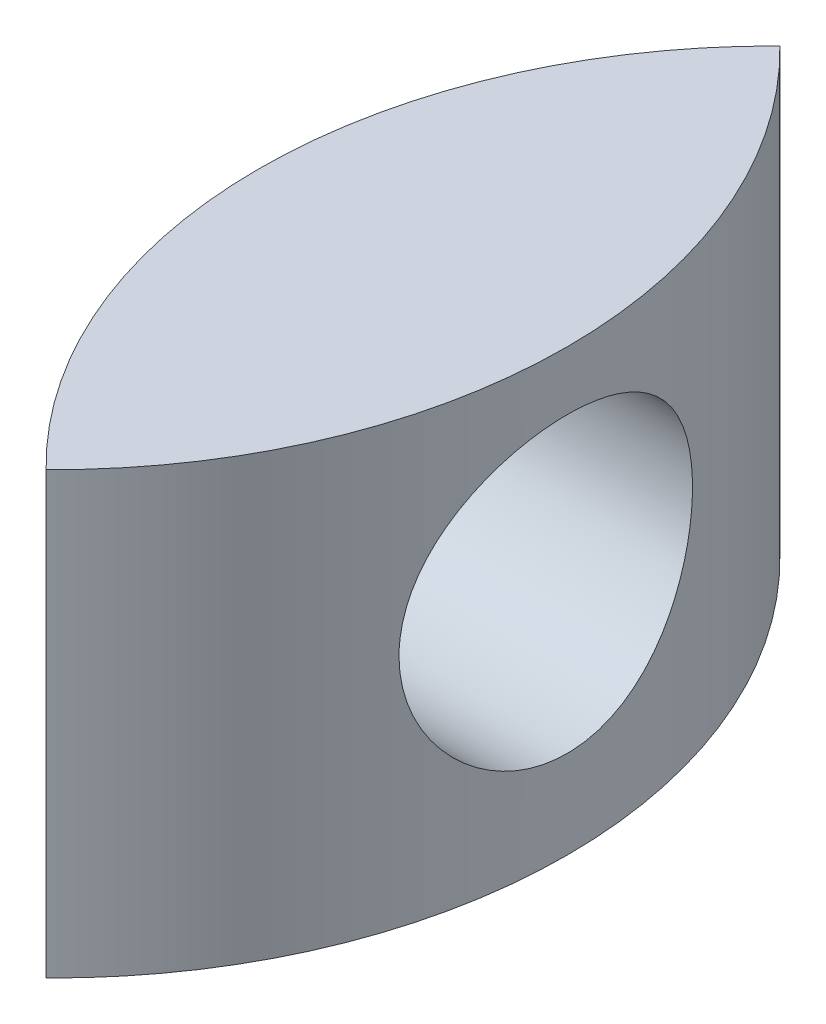
ISO-10303-21;
HEADER;
FILE_DESCRIPTION(('STEP AP214'),'2;1');
FILE_NAME('part.step','',(''),(''),'','','');
FILE_SCHEMA(('AUTOMOTIVE_DESIGN { 1 0 10303 214 1 1 1 1 }'));
ENDSEC;
DATA;
#1=APPLICATION_CONTEXT('core data for automotive mechanical design processes');
#2=APPLICATION_PROTOCOL_DEFINITION('international standard','automotive_design',2000,#1);
#3=PRODUCT_CONTEXT('',#1,'mechanical');
#4=PRODUCT('Part','Part','',(#3));
#5=PRODUCT_RELATED_PRODUCT_CATEGORY('part','',(#4));
#6=PRODUCT_DEFINITION_FORMATION('','',#4);
#7=PRODUCT_DEFINITION_CONTEXT('part definition',#1,'design');
#8=PRODUCT_DEFINITION('design','',#6,#7);
#9=PRODUCT_DEFINITION_SHAPE('','',#8);
#10=(LENGTH_UNIT() NAMED_UNIT(*) SI_UNIT(.MILLI.,.METRE.));
#11=(NAMED_UNIT(*) PLANE_ANGLE_UNIT() SI_UNIT($,.RADIAN.));
#12=(NAMED_UNIT(*) SI_UNIT($,.STERADIAN.) SOLID_ANGLE_UNIT());
#13=UNCERTAINTY_MEASURE_WITH_UNIT(LENGTH_MEASURE(1.E-05),#10,'distance_accuracy_value','');
#14=(GEOMETRIC_REPRESENTATION_CONTEXT(3) GLOBAL_UNCERTAINTY_ASSIGNED_CONTEXT((#13)) GLOBAL_UNIT_ASSIGNED_CONTEXT((#10,
#11,#12)) REPRESENTATION_CONTEXT('',''));
#15=CARTESIAN_POINT('',(0.,0.,0.));
#16=DIRECTION('',(0.,0.,1.));
#17=DIRECTION('',(1.,0.,0.));
#18=AXIS2_PLACEMENT_3D('',#15,#16,#17);
#19=CARTESIAN_POINT('',(-62.2170394666927,76.2,0.));
#20=DIRECTION('',(0.,-1.,0.));
#21=DIRECTION('',(0.,0.,-1.));
#22=AXIS2_PLACEMENT_3D('',#19,#20,#21);
#23=CYLINDRICAL_SURFACE('',#22,88.9);
#24=CARTESIAN_POINT('',(22.9771504760493,40.64,25.4));
#25=CARTESIAN_POINT('',(22.9771518354404,39.9424057015569,25.3999980746329));
#26=CARTESIAN_POINT('',(22.9857419587765,39.244776471506,25.3712372082804));
#27=CARTESIAN_POINT('',(23.0198378917772,37.8546390767836,25.2564500157261));
#28=CARTESIAN_POINT('',(23.0453448415515,37.162131260451,25.1704198298564));
#29=CARTESIAN_POINT('',(23.1124941217313,35.7870553496211,24.941829653869));
#30=CARTESIAN_POINT('',(23.1541421950163,35.1044908826712,24.7992495433295));
#31=CARTESIAN_POINT('',(23.252300278365,33.7544079375064,24.4588081272709));
#32=CARTESIAN_POINT('',(23.3088101108994,33.0868892796671,24.2609474820971));
#33=CARTESIAN_POINT('',(23.4349035426881,31.7724933208569,23.8119484715432));
#34=CARTESIAN_POINT('',(23.504466371654,31.125585111163,23.5608946677203));
#35=CARTESIAN_POINT('',(23.6547063885966,29.8555472656057,23.0072916101955));
#36=CARTESIAN_POINT('',(23.7353835991451,29.2324176780372,22.7047422519122));
#37=CARTESIAN_POINT('',(23.9055842944307,28.013819816182,22.0503497469156));
#38=CARTESIAN_POINT('',(23.9951084566809,27.4183536655455,21.6985028240554));
#39=CARTESIAN_POINT('',(24.1805428459612,26.2587665543504,20.9479627721249));
#40=CARTESIAN_POINT('',(24.2764531992645,25.6946462139922,20.5492687166349));
#41=CARTESIAN_POINT('',(24.47463579049,24.5869250120734,19.696696724419));
#42=CARTESIAN_POINT('',(24.5770085826111,24.0442382993994,19.2416540098721));
#43=CARTESIAN_POINT('',(24.7829457648739,22.9988517344297,18.2879875547486));
#44=CARTESIAN_POINT('',(24.8865101738679,22.4961525157615,17.7893631238545));
#45=CARTESIAN_POINT('',(25.0920190663341,21.5339093671124,16.7516575656736));
#46=CARTESIAN_POINT('',(25.1939633657522,21.0743703116768,16.2125718809992));
#47=CARTESIAN_POINT('',(25.393459229789,20.201554927874,15.0973946242599));
#48=CARTESIAN_POINT('',(25.4910107669529,19.7882788886267,14.5213028209613));
#49=CARTESIAN_POINT('',(25.6808326621408,19.0036048858582,13.3247050278436));
#50=CARTESIAN_POINT('',(25.7729706449731,18.633131377724,12.70357121818));
#51=CARTESIAN_POINT('',(25.9473396119169,17.9459868524624,11.4308682615547));
#52=CARTESIAN_POINT('',(26.0295704360614,17.6293167040424,10.7792986233935));
#53=CARTESIAN_POINT('',(26.1817603841931,17.0523916266243,9.45036310243901));
#54=CARTESIAN_POINT('',(26.2517213539893,16.7921282107189,8.77300111839539));
#55=CARTESIAN_POINT('',(26.3773565400985,16.3301984058481,7.39729554855956));
#56=CARTESIAN_POINT('',(26.4330311960747,16.1285302135817,6.69895260919808));
#57=CARTESIAN_POINT('',(26.5272144705206,15.7900838781734,5.30496092372372));
#58=CARTESIAN_POINT('',(26.5661331814238,15.6517495403735,4.6097175418189));
#59=CARTESIAN_POINT('',(26.6277740667931,15.4336145417296,3.2093952640432));
#60=CARTESIAN_POINT('',(26.6504964968538,15.3538129571758,2.5043165235638));
#61=CARTESIAN_POINT('',(26.6790958475958,15.2534840743216,1.08973048220658));
#62=CARTESIAN_POINT('',(26.6849755573896,15.2329469619684,0.380223934066989));
#63=CARTESIAN_POINT('',(26.6797289587866,15.2513111284601,-1.03795021217094));
#64=CARTESIAN_POINT('',(26.6686029312467,15.2902114256711,-1.74661782393123));
#65=CARTESIAN_POINT('',(26.6302294100133,15.4250997413191,-3.137300918762));
#66=CARTESIAN_POINT('',(26.6034581364429,15.519401834502,-3.81949389131813));
#67=CARTESIAN_POINT('',(26.5349015500499,15.762888643855,-5.17322775398397));
#68=CARTESIAN_POINT('',(26.4931165775056,15.9120721161671,-5.84476888515237));
#69=CARTESIAN_POINT('',(26.3956388149616,16.2640830939341,-7.17262051759684));
#70=CARTESIAN_POINT('',(26.3399455234757,16.4669125336935,-7.82893046875627));
#71=CARTESIAN_POINT('',(26.2161108044025,16.9245921903194,-9.1219403113126));
#72=CARTESIAN_POINT('',(26.1479691574853,17.1794433237749,-9.75863985695918));
#73=CARTESIAN_POINT('',(26.0001975160251,17.7422837187656,-11.015155759701));
#74=CARTESIAN_POINT('',(25.9204502975067,18.0508223679591,-11.6347121456925));
#75=CARTESIAN_POINT('',(25.7521159620121,18.7168143933,-12.8456783516543));
#76=CARTESIAN_POINT('',(25.6635288130473,19.0742679464554,-13.4370880697601));
#77=CARTESIAN_POINT('',(25.4797855914592,19.8356830670894,-14.5882388491195));
#78=CARTESIAN_POINT('',(25.3846283267694,20.2396530833318,-15.1479741297378));
#79=CARTESIAN_POINT('',(25.1902021296731,21.0913999241076,-16.232300473697));
#80=CARTESIAN_POINT('',(25.0909330988572,21.5391777974701,-16.756890695103));
#81=CARTESIAN_POINT('',(24.8873162455825,22.4921912279046,-17.785548051137));
#82=CARTESIAN_POINT('',(24.7829125026208,22.9988924966073,-18.2882471716354));
#83=CARTESIAN_POINT('',(24.5753212837435,24.0529325524353,-19.2493611635747));
#84=CARTESIAN_POINT('',(24.4721338370555,24.6002723138042,-19.7077749727389));
#85=CARTESIAN_POINT('',(24.2698647928347,25.7321293957155,-20.5772862789485));
#86=CARTESIAN_POINT('',(24.170783559104,26.316649998824,-20.9883795892059));
#87=CARTESIAN_POINT('',(23.9795769953594,27.5190654717554,-21.7603191824327));
#88=CARTESIAN_POINT('',(23.8874516351986,28.1369601969141,-22.1211656831786));
#89=CARTESIAN_POINT('',(23.7121628320087,29.4071663464714,-22.7926222204903));
#90=CARTESIAN_POINT('',(23.6290773110291,30.0597143356731,-23.1028054964779));
#91=CARTESIAN_POINT('',(23.4752798859895,31.3901300912927,-23.6668954855574));
#92=CARTESIAN_POINT('',(23.4045680978211,32.0679980947842,-23.9208016715677));
#93=CARTESIAN_POINT('',(23.2777726977542,33.4440248338669,-24.3700970476997));
#94=CARTESIAN_POINT('',(23.2216855965731,34.1421786852254,-24.5655001976267));
#95=CARTESIAN_POINT('',(23.1259434236331,35.5537041054617,-24.8960831624375));
#96=CARTESIAN_POINT('',(23.0862877632714,36.2670751282714,-25.0312651345611));
#97=CARTESIAN_POINT('',(23.0257712180616,37.6790479098863,-25.2365661030715));
#98=CARTESIAN_POINT('',(23.0043163260656,38.377325431946,-25.3087438395184));
#99=CARTESIAN_POINT('',(22.9786374260246,39.7777698813865,-25.3950525735776));
#100=CARTESIAN_POINT('',(22.9744130283039,40.4799367204491,-25.4091848839143));
#101=CARTESIAN_POINT('',(22.9833282505732,41.8828353001725,-25.3792744819155));
#102=CARTESIAN_POINT('',(22.9964658982411,42.5835671947862,-25.3352383774916));
#103=CARTESIAN_POINT('',(23.0396866227612,43.9784600747816,-25.1894109327576));
#104=CARTESIAN_POINT('',(23.0697695811513,44.6726211060646,-25.0876199962029));
#105=CARTESIAN_POINT('',(23.1450634668537,46.0334811715506,-24.8302009952261));
#106=CARTESIAN_POINT('',(23.1899113593891,46.7004448414042,-24.6758621174902));
#107=CARTESIAN_POINT('',(23.2935664640381,48.018722086043,-24.314226597435));
#108=CARTESIAN_POINT('',(23.3523734078306,48.6700359613839,-24.1069309730455));
#109=CARTESIAN_POINT('',(23.4822696506911,49.9528338346295,-23.6409995292032));
#110=CARTESIAN_POINT('',(23.5533602668555,50.5843156974904,-23.3823582038502));
#111=CARTESIAN_POINT('',(23.7058374118174,51.823420427868,-22.8156803499545));
#112=CARTESIAN_POINT('',(23.7872242035471,52.4310426855653,-22.5076425599262));
#113=CARTESIAN_POINT('',(23.9602001619449,53.6334341430915,-21.8361280405699));
#114=CARTESIAN_POINT('',(24.0519918864065,54.2275136938039,-21.4714685179877));
#115=CARTESIAN_POINT('',(24.241523405817,55.3830670797016,-20.6950844954684));
#116=CARTESIAN_POINT('',(24.3392632781851,55.9445404903097,-20.2833593828789));
#117=CARTESIAN_POINT('',(24.5380626764198,57.0315643815129,-19.4154685087649));
#118=CARTESIAN_POINT('',(24.6391228223642,57.5571080949437,-18.9592944145383));
#119=CARTESIAN_POINT('',(24.8418584998492,58.568956011495,-18.0054430563378));
#120=CARTESIAN_POINT('',(24.9435340431346,59.0552594631631,-17.5077649979325));
#121=CARTESIAN_POINT('',(25.1482343012293,60.0013418582937,-16.4564653546268));
#122=CARTESIAN_POINT('',(25.2511883646848,60.4596676779962,-15.9015210620306));
#123=CARTESIAN_POINT('',(25.4520226540981,61.3279900152185,-14.7541418440277));
#124=CARTESIAN_POINT('',(25.5499027548898,61.737985340823,-14.1617059945667));
#125=CARTESIAN_POINT('',(25.7378462985526,62.506660947922,-12.9432597736365));
#126=CARTESIAN_POINT('',(25.8279099485602,62.8653425893967,-12.3172502925831));
#127=CARTESIAN_POINT('',(25.9976827553119,63.528644661457,-11.0358684355614));
#128=CARTESIAN_POINT('',(26.0773920986013,63.8332660660398,-10.3804965888782));
#129=CARTESIAN_POINT('',(26.2236185419975,64.3838396218484,-9.05010146814636));
#130=CARTESIAN_POINT('',(26.290232605618,64.6302259580128,-8.3752686386469));
#131=CARTESIAN_POINT('',(26.4091322840188,65.0652356281639,-7.00598876761148));
#132=CARTESIAN_POINT('',(26.4614179176207,65.2538590380269,-6.31154175184169));
#133=CARTESIAN_POINT('',(26.5501417575068,65.5716216926056,-4.90832184870275));
#134=CARTESIAN_POINT('',(26.5865833512365,65.7007736526283,-4.19955205747821));
#135=CARTESIAN_POINT('',(26.6425702016156,65.8984490903381,-2.77295269663846));
#136=CARTESIAN_POINT('',(26.6621159621324,65.9669743760348,-2.0551233978436));
#137=CARTESIAN_POINT('',(26.6833601229928,66.0414218848119,-0.641253693103437));
#138=CARTESIAN_POINT('',(26.6856607978968,66.0494567456366,0.0546672814895128));
#139=CARTESIAN_POINT('',(26.673938387015,66.0084122410807,1.44467296308204));
#140=CARTESIAN_POINT('',(26.6599157084981,65.9593343006693,2.13875771546247));
#141=CARTESIAN_POINT('',(26.6159325272164,65.8045068208772,3.52002180117998));
#142=CARTESIAN_POINT('',(26.5859728513948,65.6987602219332,4.20720149092398));
#143=CARTESIAN_POINT('',(26.5109327344154,65.4315202622738,5.56978862086269));
#144=CARTESIAN_POINT('',(26.4658522290162,65.2700266647152,6.24519601102956));
#145=CARTESIAN_POINT('',(26.3622552427499,64.8943546089118,7.5735342432249));
#146=CARTESIAN_POINT('',(26.3038630676056,64.6806623435315,8.22661247068342));
#147=CARTESIAN_POINT('',(26.1749527931395,64.2015681130214,9.51226166385747));
#148=CARTESIAN_POINT('',(26.1044348151083,63.9361666651193,10.1448328346236));
#149=CARTESIAN_POINT('',(25.9530844203728,63.3556168677195,11.3855126374589));
#150=CARTESIAN_POINT('',(25.8722508039569,63.0404627309579,11.9936184133591));
#151=CARTESIAN_POINT('',(25.7023366443155,62.3626677274187,13.1815550429383));
#152=CARTESIAN_POINT('',(25.6132558950537,62.0000256741664,13.7613851896604));
#153=CARTESIAN_POINT('',(25.4263582741332,61.2182276596337,14.9060757916653));
#154=CARTESIAN_POINT('',(25.3283603741733,60.79771166846,15.4699781345738));
#155=CARTESIAN_POINT('',(25.128618956615,59.9117476324061,16.5605969342947));
#156=CARTESIAN_POINT('',(25.0268753671791,59.4462987254898,17.0873126773478));
#157=CARTESIAN_POINT('',(24.8223327965364,58.4733541298589,18.1004101627905));
#158=CARTESIAN_POINT('',(24.7195335481027,57.9658475528309,18.5867813947647));
#159=CARTESIAN_POINT('',(24.5156734942255,56.9120823136327,19.5159627149234));
#160=CARTESIAN_POINT('',(24.4146127017227,56.3658233631518,19.9587724789599));
#161=CARTESIAN_POINT('',(24.2143895554368,55.2230908342239,20.808985132166));
#162=CARTESIAN_POINT('',(24.1153470908821,54.6256742816044,21.2151500652063));
#163=CARTESIAN_POINT('',(23.9249114645363,53.3974947937105,21.97562334543));
#164=CARTESIAN_POINT('',(23.8335186306757,52.7667304307451,22.3299294699761));
#165=CARTESIAN_POINT('',(23.6611882479052,51.4764442393731,22.9837837875923));
#166=CARTESIAN_POINT('',(23.5802456191109,50.8169365933206,23.2833586153752));
#167=CARTESIAN_POINT('',(23.4312855061718,49.4735133859037,23.8254812304186));
#168=CARTESIAN_POINT('',(23.363266528603,48.7896006555908,24.0680356075859));
#169=CARTESIAN_POINT('',(23.2503445198719,47.4944186737057,24.4657530251816));
#170=CARTESIAN_POINT('',(23.2035718971717,46.8855500856123,24.6282411008886));
#171=CARTESIAN_POINT('',(23.122524307213,45.6566616467678,24.9076306176086));
#172=CARTESIAN_POINT('',(23.0882480408101,45.0366429622378,25.0245367974878));
#173=CARTESIAN_POINT('',(23.0330556184026,43.7891194877251,25.2119187806862));
#174=CARTESIAN_POINT('',(23.0121376958427,43.1616156987845,25.2824007233518));
#175=CARTESIAN_POINT('',(22.9841839204183,41.9027510270571,25.3764441953033));
#176=CARTESIAN_POINT('',(22.9771492456698,41.2713898214942,25.4000017426421));
#177=CARTESIAN_POINT('',(22.9771504760493,40.64,25.4));
#178=B_SPLINE_CURVE_WITH_KNOTS('',3,(#24,#25,#26,#27,#28,#29,#30,#31,#32,#33,#34,#35,#36,#37,
#38,#39,#40,#41,#42,#43,#44,#45,#46,#47,#48,#49,#50,#51,#52,#53,#54,#55,#56,#57,#58,#59,#60,#61,
#62,#63,#64,#65,#66,#67,#68,#69,#70,#71,#72,#73,#74,#75,#76,#77,#78,#79,#80,#81,#82,#83,#84,#85,
#86,#87,#88,#89,#90,#91,#92,#93,#94,#95,#96,#97,#98,#99,#100,#101,#102,#103,#104,#105,#106,#107,
#108,#109,#110,#111,#112,#113,#114,#115,#116,#117,#118,#119,#120,#121,#122,#123,#124,#125,#126,
#127,#128,#129,#130,#131,#132,#133,#134,#135,#136,#137,#138,#139,#140,#141,#142,#143,#144,#145,
#146,#147,#148,#149,#150,#151,#152,#153,#154,#155,#156,#157,#158,#159,#160,#161,#162,#163,#164,
#165,#166,#167,#168,#169,#170,#171,#172,#173,#174,#175,#176,#177),.UNSPECIFIED.,.T.,.F.,(4,2,2,
2,2,2,2,2,2,2,2,2,2,2,2,2,2,2,2,2,2,2,2,2,2,2,2,2,2,2,2,2,2,2,2,2,2,2,2,2,2,2,2,2,2,2,2,2,2,2,2,
2,2,2,2,2,2,2,2,2,2,2,2,2,2,2,2,2,2,2,2,2,2,2,2,2,4),(0.,2.0922006613115,4.18454234084124,
6.27762914281294,8.37069094319926,10.4604500231152,12.5502133471432,14.6401368326654,
16.7301016541676,18.874376088887,21.0186844942473,23.1632347891149,25.3077984855638,
27.4923464126319,29.676929607994,31.8611838843542,34.0453709319347,36.172552997141,
38.2997014924049,40.4264977168178,42.5532588166698,44.6184274856388,46.6835493515077,
48.7487456893063,50.8139784176829,52.9017421895296,54.9895135165494,57.0776646444313,
59.1658657781832,61.327412040499,63.4890101392049,65.6507993434226,67.8125791778664,
69.9917217334547,72.1708846976602,74.3495272618584,76.5280917765618,78.6324732032805,
80.7368070381697,82.8409018420312,84.9449819366604,87.0007729953575,89.0565245408018,
91.1124966477133,93.1685212683491,95.2754003712137,97.3823069024239,99.4896091710637,
101.596951785042,103.775558863509,105.95421965903,108.132822702225,110.311386489789,
112.473155450086,114.634921570708,116.796225279577,118.957464531839,121.04285572646,
123.128194891512,125.213425862472,127.298665692721,129.365177821926,131.431669281645,
133.498401294299,135.565184953636,137.693437800024,139.821731484977,141.950577895745,
144.079440146417,146.264308455028,148.449270378376,150.633166152016,152.816809406559,
154.710738660055,156.604470960972,158.497952776045,160.391595262836),.UNSPECIFIED.);
#179=CARTESIAN_POINT('',(22.9771504760493,40.64,25.4));
#180=VERTEX_POINT('',#179);
#181=EDGE_CURVE('E67',#180,#180,#178,.T.);
#182=ORIENTED_EDGE('',*,*,#181,.F.);
#183=EDGE_LOOP('',(#182));
#184=FACE_BOUND('',#183,.T.);
#185=CARTESIAN_POINT('',(-62.2170394666927,0.,0.));
#186=DIRECTION('',(0.,1.,0.));
#187=DIRECTION('',(0.,0.,-1.));
#188=AXIS2_PLACEMENT_3D('',#185,#186,#187);
#189=CIRCLE('',#188,88.9);
#190=CARTESIAN_POINT('',(0.,0.,63.5));
#191=VERTEX_POINT('',#190);
#192=CARTESIAN_POINT('',(0.,0.,-63.5));
#193=VERTEX_POINT('',#192);
#194=EDGE_CURVE('E37',#191,#193,#189,.T.);
#195=ORIENTED_EDGE('',*,*,#194,.T.);
#196=DIRECTION('',(0.,-1.,0.));
#197=VECTOR('',#196,1.);
#198=CARTESIAN_POINT('',(0.,76.2,-63.5));
#199=LINE('',#198,#197);
#200=CARTESIAN_POINT('',(0.,76.2,-63.5));
#201=VERTEX_POINT('',#200);
#202=EDGE_CURVE('E60',#201,#193,#199,.T.);
#203=ORIENTED_EDGE('',*,*,#202,.F.);
#204=CARTESIAN_POINT('',(-62.2170394666927,76.2,0.));
#205=DIRECTION('',(0.,1.,0.));
#206=DIRECTION('',(0.,0.,-1.));
#207=AXIS2_PLACEMENT_3D('',#204,#205,#206);
#208=CIRCLE('',#207,88.9);
#209=CARTESIAN_POINT('',(0.,76.2,63.5));
#210=VERTEX_POINT('',#209);
#211=EDGE_CURVE('E11',#210,#201,#208,.T.);
#212=ORIENTED_EDGE('',*,*,#211,.F.);
#213=DIRECTION('',(0.,-1.,0.));
#214=VECTOR('',#213,1.);
#215=CARTESIAN_POINT('',(0.,76.2,63.5));
#216=LINE('',#215,#214);
#217=EDGE_CURVE('E56',#210,#191,#216,.T.);
#218=ORIENTED_EDGE('',*,*,#217,.T.);
#219=EDGE_LOOP('',(#195,#203,#212,#218));
#220=FACE_BOUND('',#219,.T.);
#221=ADVANCED_FACE('F34',(#184,#220),#23,.T.);
#222=CARTESIAN_POINT('',(-62.2170394666927,76.2,0.));
#223=DIRECTION('',(0.,-1.,0.));
#224=DIRECTION('',(0.,0.,-1.));
#225=AXIS2_PLACEMENT_3D('',#222,#223,#224);
#226=PLANE('',#225);
#227=ORIENTED_EDGE('',*,*,#211,.T.);
#228=CARTESIAN_POINT('',(62.2170394666927,76.2,0.));
#229=DIRECTION('',(0.,-1.,0.));
#230=DIRECTION('',(0.,0.,-1.));
#231=AXIS2_PLACEMENT_3D('',#228,#229,#230);
#232=CIRCLE('',#231,88.9);
#233=EDGE_CURVE('E61',#210,#201,#232,.T.);
#234=ORIENTED_EDGE('',*,*,#233,.F.);
#235=EDGE_LOOP('',(#227,#234));
#236=FACE_BOUND('',#235,.T.);
#237=ADVANCED_FACE('F101',(#236),#226,.F.);
#238=CARTESIAN_POINT('',(-62.2170394666927,0.,0.));
#239=DIRECTION('',(0.,-1.,0.));
#240=DIRECTION('',(0.,0.,-1.));
#241=AXIS2_PLACEMENT_3D('',#238,#239,#240);
#242=PLANE('',#241);
#243=ORIENTED_EDGE('',*,*,#194,.F.);
#244=CARTESIAN_POINT('',(62.2170394666927,0.,0.));
#245=DIRECTION('',(0.,-1.,0.));
#246=DIRECTION('',(0.,0.,-1.));
#247=AXIS2_PLACEMENT_3D('',#244,#245,#246);
#248=CIRCLE('',#247,88.9);
#249=EDGE_CURVE('E66',#191,#193,#248,.T.);
#250=ORIENTED_EDGE('',*,*,#249,.T.);
#251=EDGE_LOOP('',(#243,#250));
#252=FACE_BOUND('',#251,.T.);
#253=ADVANCED_FACE('F65',(#252),#242,.T.);
#254=CARTESIAN_POINT('',(26.6839605333073,40.64,0.));
#255=DIRECTION('',(-1.,0.,0.));
#256=DIRECTION('',(0.,0.,1.));
#257=AXIS2_PLACEMENT_3D('',#254,#255,#256);
#258=CYLINDRICAL_SURFACE('',#257,25.4);
#259=ORIENTED_EDGE('',*,*,#181,.T.);
#260=EDGE_LOOP('',(#259));
#261=FACE_BOUND('',#260,.T.);
#262=CARTESIAN_POINT('',(-22.9771504760493,40.64,25.4));
#263=CARTESIAN_POINT('',(-22.9771518354404,39.9424057015569,25.3999980746329));
#264=CARTESIAN_POINT('',(-22.9857419587765,39.244776471506,25.3712372082804));
#265=CARTESIAN_POINT('',(-23.0198378917772,37.8546390767836,25.2564500157261));
#266=CARTESIAN_POINT('',(-23.0453448415515,37.162131260451,25.1704198298564));
#267=CARTESIAN_POINT('',(-23.1124941217313,35.7870553496211,24.941829653869));
#268=CARTESIAN_POINT('',(-23.1541421950163,35.1044908826712,24.7992495433295));
#269=CARTESIAN_POINT('',(-23.252300278365,33.7544079375064,24.4588081272709));
#270=CARTESIAN_POINT('',(-23.3088101108994,33.0868892796671,24.2609474820971));
#271=CARTESIAN_POINT('',(-23.4349035426881,31.7724933208569,23.8119484715432));
#272=CARTESIAN_POINT('',(-23.504466371654,31.125585111163,23.5608946677203));
#273=CARTESIAN_POINT('',(-23.6547063885966,29.8555472656057,23.0072916101955));
#274=CARTESIAN_POINT('',(-23.7353835991451,29.2324176780372,22.7047422519122));
#275=CARTESIAN_POINT('',(-23.9055842944307,28.013819816182,22.0503497469156));
#276=CARTESIAN_POINT('',(-23.9951084566809,27.4183536655455,21.6985028240554));
#277=CARTESIAN_POINT('',(-24.1805428459612,26.2587665543504,20.9479627721249));
#278=CARTESIAN_POINT('',(-24.2764531992645,25.6946462139922,20.5492687166349));
#279=CARTESIAN_POINT('',(-24.47463579049,24.5869250120734,19.696696724419));
#280=CARTESIAN_POINT('',(-24.5770085826111,24.0442382993994,19.2416540098721));
#281=CARTESIAN_POINT('',(-24.7829457648739,22.9988517344297,18.2879875547486));
#282=CARTESIAN_POINT('',(-24.8865101738679,22.4961525157615,17.7893631238545));
#283=CARTESIAN_POINT('',(-25.0920190663341,21.5339093671124,16.7516575656736));
#284=CARTESIAN_POINT('',(-25.1939633657522,21.0743703116768,16.2125718809992));
#285=CARTESIAN_POINT('',(-25.393459229789,20.201554927874,15.0973946242599));
#286=CARTESIAN_POINT('',(-25.4910107669529,19.7882788886267,14.5213028209613));
#287=CARTESIAN_POINT('',(-25.6808326621408,19.0036048858582,13.3247050278436));
#288=CARTESIAN_POINT('',(-25.7729706449731,18.633131377724,12.70357121818));
#289=CARTESIAN_POINT('',(-25.9473396119169,17.9459868524624,11.4308682615547));
#290=CARTESIAN_POINT('',(-26.0295704360614,17.6293167040424,10.7792986233935));
#291=CARTESIAN_POINT('',(-26.1817603841931,17.0523916266243,9.45036310243901));
#292=CARTESIAN_POINT('',(-26.2517213539893,16.7921282107189,8.77300111839539));
#293=CARTESIAN_POINT('',(-26.3773565400985,16.3301984058481,7.39729554855956));
#294=CARTESIAN_POINT('',(-26.4330311960747,16.1285302135817,6.69895260919808));
#295=CARTESIAN_POINT('',(-26.5272144705206,15.7900838781734,5.30496092372372));
#296=CARTESIAN_POINT('',(-26.5661331814238,15.6517495403735,4.6097175418189));
#297=CARTESIAN_POINT('',(-26.6277740667931,15.4336145417296,3.2093952640432));
#298=CARTESIAN_POINT('',(-26.6504964968538,15.3538129571758,2.5043165235638));
#299=CARTESIAN_POINT('',(-26.6790958475958,15.2534840743216,1.08973048220658));
#300=CARTESIAN_POINT('',(-26.6849755573896,15.2329469619684,0.380223934066989));
#301=CARTESIAN_POINT('',(-26.6797289587866,15.2513111284601,-1.03795021217094));
#302=CARTESIAN_POINT('',(-26.6686029312467,15.2902114256711,-1.74661782393123));
#303=CARTESIAN_POINT('',(-26.6302294100133,15.4250997413191,-3.137300918762));
#304=CARTESIAN_POINT('',(-26.6034581364429,15.519401834502,-3.81949389131813));
#305=CARTESIAN_POINT('',(-26.5349015500499,15.762888643855,-5.17322775398397));
#306=CARTESIAN_POINT('',(-26.4931165775056,15.9120721161671,-5.84476888515237));
#307=CARTESIAN_POINT('',(-26.3956388149616,16.2640830939341,-7.17262051759684));
#308=CARTESIAN_POINT('',(-26.3399455234757,16.4669125336935,-7.82893046875627));
#309=CARTESIAN_POINT('',(-26.2161108044025,16.9245921903194,-9.1219403113126));
#310=CARTESIAN_POINT('',(-26.1479691574853,17.1794433237749,-9.75863985695918));
#311=CARTESIAN_POINT('',(-26.0001975160251,17.7422837187656,-11.015155759701));
#312=CARTESIAN_POINT('',(-25.9204502975067,18.0508223679591,-11.6347121456925));
#313=CARTESIAN_POINT('',(-25.7521159620121,18.7168143933,-12.8456783516543));
#314=CARTESIAN_POINT('',(-25.6635288130473,19.0742679464554,-13.4370880697601));
#315=CARTESIAN_POINT('',(-25.4797855914592,19.8356830670894,-14.5882388491195));
#316=CARTESIAN_POINT('',(-25.3846283267694,20.2396530833318,-15.1479741297378));
#317=CARTESIAN_POINT('',(-25.1902021296731,21.0913999241076,-16.232300473697));
#318=CARTESIAN_POINT('',(-25.0909330988572,21.5391777974701,-16.756890695103));
#319=CARTESIAN_POINT('',(-24.8873162455825,22.4921912279046,-17.785548051137));
#320=CARTESIAN_POINT('',(-24.7829125026208,22.9988924966073,-18.2882471716354));
#321=CARTESIAN_POINT('',(-24.5753212837435,24.0529325524353,-19.2493611635747));
#322=CARTESIAN_POINT('',(-24.4721338370555,24.6002723138042,-19.7077749727389));
#323=CARTESIAN_POINT('',(-24.2698647928347,25.7321293957155,-20.5772862789485));
#324=CARTESIAN_POINT('',(-24.170783559104,26.316649998824,-20.9883795892059));
#325=CARTESIAN_POINT('',(-23.9795769953594,27.5190654717554,-21.7603191824327));
#326=CARTESIAN_POINT('',(-23.8874516351986,28.1369601969141,-22.1211656831786));
#327=CARTESIAN_POINT('',(-23.7121628320087,29.4071663464714,-22.7926222204903));
#328=CARTESIAN_POINT('',(-23.6290773110291,30.0597143356731,-23.1028054964779));
#329=CARTESIAN_POINT('',(-23.4752798859895,31.3901300912927,-23.6668954855574));
#330=CARTESIAN_POINT('',(-23.4045680978211,32.0679980947842,-23.9208016715677));
#331=CARTESIAN_POINT('',(-23.2777726977542,33.4440248338669,-24.3700970476997));
#332=CARTESIAN_POINT('',(-23.2216855965731,34.1421786852254,-24.5655001976267));
#333=CARTESIAN_POINT('',(-23.1259434236331,35.5537041054617,-24.8960831624375));
#334=CARTESIAN_POINT('',(-23.0862877632714,36.2670751282714,-25.0312651345611));
#335=CARTESIAN_POINT('',(-23.0257712180616,37.6790479098863,-25.2365661030715));
#336=CARTESIAN_POINT('',(-23.0043163260656,38.377325431946,-25.3087438395184));
#337=CARTESIAN_POINT('',(-22.9786374260246,39.7777698813865,-25.3950525735776));
#338=CARTESIAN_POINT('',(-22.9744130283039,40.4799367204491,-25.4091848839143));
#339=CARTESIAN_POINT('',(-22.9833282505732,41.8828353001725,-25.3792744819155));
#340=CARTESIAN_POINT('',(-22.9964658982411,42.5835671947862,-25.3352383774916));
#341=CARTESIAN_POINT('',(-23.0396866227612,43.9784600747816,-25.1894109327576));
#342=CARTESIAN_POINT('',(-23.0697695811513,44.6726211060646,-25.0876199962029));
#343=CARTESIAN_POINT('',(-23.1450634668537,46.0334811715506,-24.8302009952261));
#344=CARTESIAN_POINT('',(-23.1899113593891,46.7004448414042,-24.6758621174902));
#345=CARTESIAN_POINT('',(-23.2935664640381,48.018722086043,-24.314226597435));
#346=CARTESIAN_POINT('',(-23.3523734078306,48.6700359613839,-24.1069309730455));
#347=CARTESIAN_POINT('',(-23.4822696506911,49.9528338346295,-23.6409995292032));
#348=CARTESIAN_POINT('',(-23.5533602668555,50.5843156974904,-23.3823582038502));
#349=CARTESIAN_POINT('',(-23.7058374118174,51.823420427868,-22.8156803499545));
#350=CARTESIAN_POINT('',(-23.7872242035471,52.4310426855653,-22.5076425599262));
#351=CARTESIAN_POINT('',(-23.9602001619449,53.6334341430915,-21.8361280405699));
#352=CARTESIAN_POINT('',(-24.0519918864065,54.2275136938039,-21.4714685179877));
#353=CARTESIAN_POINT('',(-24.241523405817,55.3830670797016,-20.6950844954684));
#354=CARTESIAN_POINT('',(-24.3392632781851,55.9445404903097,-20.2833593828789));
#355=CARTESIAN_POINT('',(-24.5380626764198,57.0315643815129,-19.4154685087649));
#356=CARTESIAN_POINT('',(-24.6391228223642,57.5571080949437,-18.9592944145383));
#357=CARTESIAN_POINT('',(-24.8418584998492,58.568956011495,-18.0054430563378));
#358=CARTESIAN_POINT('',(-24.9435340431346,59.0552594631631,-17.5077649979325));
#359=CARTESIAN_POINT('',(-25.1482343012293,60.0013418582937,-16.4564653546268));
#360=CARTESIAN_POINT('',(-25.2511883646848,60.4596676779962,-15.9015210620306));
#361=CARTESIAN_POINT('',(-25.4520226540981,61.3279900152185,-14.7541418440277));
#362=CARTESIAN_POINT('',(-25.5499027548898,61.737985340823,-14.1617059945667));
#363=CARTESIAN_POINT('',(-25.7378462985526,62.506660947922,-12.9432597736365));
#364=CARTESIAN_POINT('',(-25.8279099485602,62.8653425893967,-12.3172502925831));
#365=CARTESIAN_POINT('',(-25.9976827553119,63.528644661457,-11.0358684355614));
#366=CARTESIAN_POINT('',(-26.0773920986013,63.8332660660398,-10.3804965888782));
#367=CARTESIAN_POINT('',(-26.2236185419975,64.3838396218484,-9.05010146814636));
#368=CARTESIAN_POINT('',(-26.290232605618,64.6302259580128,-8.3752686386469));
#369=CARTESIAN_POINT('',(-26.4091322840188,65.0652356281639,-7.00598876761148));
#370=CARTESIAN_POINT('',(-26.4614179176207,65.2538590380269,-6.31154175184169));
#371=CARTESIAN_POINT('',(-26.5501417575068,65.5716216926056,-4.90832184870275));
#372=CARTESIAN_POINT('',(-26.5865833512365,65.7007736526283,-4.19955205747821));
#373=CARTESIAN_POINT('',(-26.6425702016156,65.8984490903381,-2.77295269663846));
#374=CARTESIAN_POINT('',(-26.6621159621324,65.9669743760348,-2.0551233978436));
#375=CARTESIAN_POINT('',(-26.6833601229928,66.0414218848119,-0.641253693103437));
#376=CARTESIAN_POINT('',(-26.6856607978968,66.0494567456366,0.0546672814895128));
#377=CARTESIAN_POINT('',(-26.673938387015,66.0084122410807,1.44467296308204));
#378=CARTESIAN_POINT('',(-26.6599157084981,65.9593343006693,2.13875771546247));
#379=CARTESIAN_POINT('',(-26.6159325272164,65.8045068208772,3.52002180117998));
#380=CARTESIAN_POINT('',(-26.5859728513948,65.6987602219332,4.20720149092398));
#381=CARTESIAN_POINT('',(-26.5109327344154,65.4315202622738,5.56978862086269));
#382=CARTESIAN_POINT('',(-26.4658522290162,65.2700266647152,6.24519601102956));
#383=CARTESIAN_POINT('',(-26.3622552427499,64.8943546089118,7.5735342432249));
#384=CARTESIAN_POINT('',(-26.3038630676056,64.6806623435315,8.22661247068342));
#385=CARTESIAN_POINT('',(-26.1749527931395,64.2015681130214,9.51226166385747));
#386=CARTESIAN_POINT('',(-26.1044348151083,63.9361666651193,10.1448328346236));
#387=CARTESIAN_POINT('',(-25.9530844203728,63.3556168677195,11.3855126374589));
#388=CARTESIAN_POINT('',(-25.8722508039569,63.0404627309579,11.9936184133591));
#389=CARTESIAN_POINT('',(-25.7023366443155,62.3626677274187,13.1815550429383));
#390=CARTESIAN_POINT('',(-25.6132558950537,62.0000256741664,13.7613851896604));
#391=CARTESIAN_POINT('',(-25.4263582741332,61.2182276596337,14.9060757916653));
#392=CARTESIAN_POINT('',(-25.3283603741733,60.79771166846,15.4699781345738));
#393=CARTESIAN_POINT('',(-25.128618956615,59.9117476324061,16.5605969342947));
#394=CARTESIAN_POINT('',(-25.0268753671791,59.4462987254898,17.0873126773478));
#395=CARTESIAN_POINT('',(-24.8223327965364,58.4733541298589,18.1004101627905));
#396=CARTESIAN_POINT('',(-24.7195335481027,57.9658475528309,18.5867813947647));
#397=CARTESIAN_POINT('',(-24.5156734942255,56.9120823136327,19.5159627149234));
#398=CARTESIAN_POINT('',(-24.4146127017227,56.3658233631518,19.9587724789599));
#399=CARTESIAN_POINT('',(-24.2143895554368,55.2230908342239,20.808985132166));
#400=CARTESIAN_POINT('',(-24.1153470908821,54.6256742816044,21.2151500652063));
#401=CARTESIAN_POINT('',(-23.9249114645363,53.3974947937105,21.97562334543));
#402=CARTESIAN_POINT('',(-23.8335186306757,52.7667304307451,22.3299294699761));
#403=CARTESIAN_POINT('',(-23.6611882479052,51.4764442393731,22.9837837875923));
#404=CARTESIAN_POINT('',(-23.5802456191109,50.8169365933206,23.2833586153752));
#405=CARTESIAN_POINT('',(-23.4312855061718,49.4735133859037,23.8254812304186));
#406=CARTESIAN_POINT('',(-23.363266528603,48.7896006555908,24.0680356075859));
#407=CARTESIAN_POINT('',(-23.2503445198719,47.4944186737057,24.4657530251816));
#408=CARTESIAN_POINT('',(-23.2035718971717,46.8855500856123,24.6282411008886));
#409=CARTESIAN_POINT('',(-23.122524307213,45.6566616467678,24.9076306176086));
#410=CARTESIAN_POINT('',(-23.0882480408101,45.0366429622378,25.0245367974878));
#411=CARTESIAN_POINT('',(-23.0330556184026,43.7891194877251,25.2119187806862));
#412=CARTESIAN_POINT('',(-23.0121376958427,43.1616156987845,25.2824007233518));
#413=CARTESIAN_POINT('',(-22.9841839204183,41.9027510270571,25.3764441953033));
#414=CARTESIAN_POINT('',(-22.9771492456698,41.2713898214942,25.4000017426421));
#415=CARTESIAN_POINT('',(-22.9771504760493,40.64,25.4));
#416=B_SPLINE_CURVE_WITH_KNOTS('',3,(#262,#263,#264,#265,#266,#267,#268,#269,#270,#271,#272,
#273,#274,#275,#276,#277,#278,#279,#280,#281,#282,#283,#284,#285,#286,#287,#288,#289,#290,#291,
#292,#293,#294,#295,#296,#297,#298,#299,#300,#301,#302,#303,#304,#305,#306,#307,#308,#309,#310,
#311,#312,#313,#314,#315,#316,#317,#318,#319,#320,#321,#322,#323,#324,#325,#326,#327,#328,#329,
#330,#331,#332,#333,#334,#335,#336,#337,#338,#339,#340,#341,#342,#343,#344,#345,#346,#347,#348,
#349,#350,#351,#352,#353,#354,#355,#356,#357,#358,#359,#360,#361,#362,#363,#364,#365,#366,#367,
#368,#369,#370,#371,#372,#373,#374,#375,#376,#377,#378,#379,#380,#381,#382,#383,#384,#385,#386,
#387,#388,#389,#390,#391,#392,#393,#394,#395,#396,#397,#398,#399,#400,#401,#402,#403,#404,#405,
#406,#407,#408,#409,#410,#411,#412,#413,#414,#415),.UNSPECIFIED.,.T.,.F.,(4,2,2,2,2,2,2,2,2,2,2,
2,2,2,2,2,2,2,2,2,2,2,2,2,2,2,2,2,2,2,2,2,2,2,2,2,2,2,2,2,2,2,2,2,2,2,2,2,2,2,2,2,2,2,2,2,2,2,2,
2,2,2,2,2,2,2,2,2,2,2,2,2,2,2,2,2,4),(0.,2.0922006613115,4.18454234084124,6.27762914281294,
8.37069094319926,10.4604500231152,12.5502133471432,14.6401368326654,16.7301016541676,
18.874376088887,21.0186844942473,23.1632347891149,25.3077984855638,27.4923464126319,
29.676929607994,31.8611838843542,34.0453709319347,36.172552997141,38.2997014924049,
40.4264977168178,42.5532588166698,44.6184274856388,46.6835493515077,48.7487456893063,
50.8139784176829,52.9017421895296,54.9895135165494,57.0776646444313,59.1658657781832,
61.327412040499,63.4890101392049,65.6507993434226,67.8125791778664,69.9917217334547,
72.1708846976602,74.3495272618584,76.5280917765618,78.6324732032805,80.7368070381697,
82.8409018420312,84.9449819366604,87.0007729953575,89.0565245408018,91.1124966477133,
93.1685212683491,95.2754003712137,97.3823069024239,99.4896091710637,101.596951785042,
103.775558863509,105.95421965903,108.132822702225,110.311386489789,112.473155450086,
114.634921570708,116.796225279577,118.957464531839,121.04285572646,123.128194891512,
125.213425862472,127.298665692721,129.365177821926,131.431669281645,133.498401294299,
135.565184953636,137.693437800024,139.821731484977,141.950577895745,144.079440146417,
146.264308455028,148.449270378376,150.633166152016,152.816809406559,154.710738660055,
156.604470960972,158.497952776045,160.391595262836),.UNSPECIFIED.);
#417=CARTESIAN_POINT('',(-22.9771504760493,40.64,25.4));
#418=VERTEX_POINT('',#417);
#419=EDGE_CURVE('E69',#418,#418,#416,.T.);
#420=ORIENTED_EDGE('',*,*,#419,.F.);
#421=EDGE_LOOP('',(#420));
#422=FACE_BOUND('',#421,.T.);
#423=ADVANCED_FACE('F82',(#261,#422),#258,.F.);
#424=CARTESIAN_POINT('',(62.2170394666927,76.2,0.));
#425=DIRECTION('',(0.,-1.,0.));
#426=DIRECTION('',(0.,0.,-1.));
#427=AXIS2_PLACEMENT_3D('',#424,#425,#426);
#428=CYLINDRICAL_SURFACE('',#427,88.9);
#429=ORIENTED_EDGE('',*,*,#419,.T.);
#430=EDGE_LOOP('',(#429));
#431=FACE_BOUND('',#430,.T.);
#432=ORIENTED_EDGE('',*,*,#249,.F.);
#433=ORIENTED_EDGE('',*,*,#217,.F.);
#434=ORIENTED_EDGE('',*,*,#233,.T.);
#435=ORIENTED_EDGE('',*,*,#202,.T.);
#436=EDGE_LOOP('',(#432,#433,#434,#435));
#437=FACE_BOUND('',#436,.T.);
#438=ADVANCED_FACE('F68',(#431,#437),#428,.T.);
#439=CLOSED_SHELL('',(#221,#237,#253,#423,#438));
#440=MANIFOLD_SOLID_BREP('B2',#439);
#441=ADVANCED_BREP_SHAPE_REPRESENTATION('',(#18,#440),#14);
#442=SHAPE_DEFINITION_REPRESENTATION(#9,#441);
ENDSEC;
END-ISO-10303-21;
